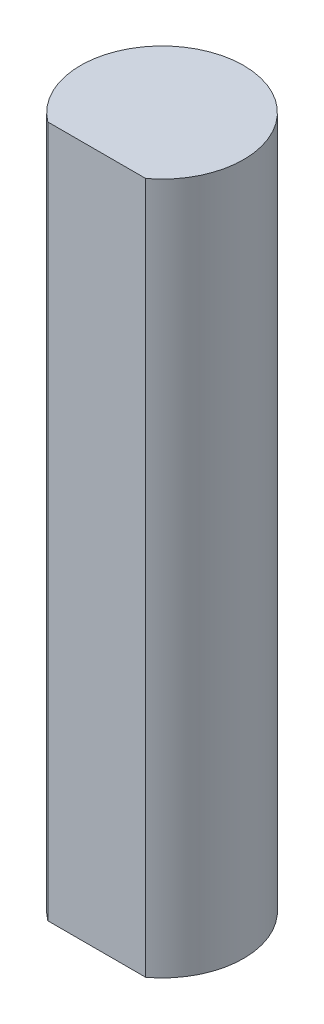
ISO-10303-21;
HEADER;
FILE_DESCRIPTION(('STEP AP214'),'2;1');
FILE_NAME('part.step','',(''),(''),'','','');
FILE_SCHEMA(('AUTOMOTIVE_DESIGN { 1 0 10303 214 1 1 1 1 }'));
ENDSEC;
DATA;
#1=APPLICATION_CONTEXT('core data for automotive mechanical design processes');
#2=APPLICATION_PROTOCOL_DEFINITION('international standard','automotive_design',2000,#1);
#3=PRODUCT_CONTEXT('',#1,'mechanical');
#4=PRODUCT('Part','Part','',(#3));
#5=PRODUCT_RELATED_PRODUCT_CATEGORY('part','',(#4));
#6=PRODUCT_DEFINITION_FORMATION('','',#4);
#7=PRODUCT_DEFINITION_CONTEXT('part definition',#1,'design');
#8=PRODUCT_DEFINITION('design','',#6,#7);
#9=PRODUCT_DEFINITION_SHAPE('','',#8);
#10=(LENGTH_UNIT() NAMED_UNIT(*) SI_UNIT(.MILLI.,.METRE.));
#11=(NAMED_UNIT(*) PLANE_ANGLE_UNIT() SI_UNIT($,.RADIAN.));
#12=(NAMED_UNIT(*) SI_UNIT($,.STERADIAN.) SOLID_ANGLE_UNIT());
#13=UNCERTAINTY_MEASURE_WITH_UNIT(LENGTH_MEASURE(1.E-05),#10,'distance_accuracy_value','');
#14=(GEOMETRIC_REPRESENTATION_CONTEXT(3) GLOBAL_UNCERTAINTY_ASSIGNED_CONTEXT((#13)) GLOBAL_UNIT_ASSIGNED_CONTEXT((#10,
#11,#12)) REPRESENTATION_CONTEXT('',''));
#15=CARTESIAN_POINT('',(0.,0.,0.));
#16=DIRECTION('',(0.,0.,1.));
#17=DIRECTION('',(1.,0.,0.));
#18=AXIS2_PLACEMENT_3D('',#15,#16,#17);
#19=CARTESIAN_POINT('',(0.,63.09,0.));
#20=DIRECTION('',(0.,-1.,0.));
#21=DIRECTION('',(0.,0.,-1.));
#22=AXIS2_PLACEMENT_3D('',#19,#20,#21);
#23=CYLINDRICAL_SURFACE('',#22,2.5);
#24=CARTESIAN_POINT('',(0.,41.89,0.));
#25=DIRECTION('',(0.,1.,0.));
#26=DIRECTION('',(0.,0.,1.));
#27=AXIS2_PLACEMENT_3D('',#24,#25,#26);
#28=CIRCLE('',#27,2.5);
#29=CARTESIAN_POINT('',(1.5,41.89,2.));
#30=VERTEX_POINT('',#29);
#31=CARTESIAN_POINT('',(-1.5,41.89,2.));
#32=VERTEX_POINT('',#31);
#33=EDGE_CURVE('E82',#30,#32,#28,.T.);
#34=ORIENTED_EDGE('',*,*,#33,.T.);
#35=DIRECTION('',(0.,-1.,0.));
#36=VECTOR('',#35,1.);
#37=CARTESIAN_POINT('',(-1.5,63.09,2.));
#38=LINE('',#37,#36);
#39=CARTESIAN_POINT('',(-1.5,63.09,2.));
#40=VERTEX_POINT('',#39);
#41=EDGE_CURVE('E11',#40,#32,#38,.T.);
#42=ORIENTED_EDGE('',*,*,#41,.F.);
#43=CARTESIAN_POINT('',(0.,63.09,0.));
#44=DIRECTION('',(0.,1.,0.));
#45=DIRECTION('',(0.,0.,1.));
#46=AXIS2_PLACEMENT_3D('',#43,#44,#45);
#47=CIRCLE('',#46,2.5);
#48=CARTESIAN_POINT('',(1.5,63.09,2.));
#49=VERTEX_POINT('',#48);
#50=EDGE_CURVE('E81',#49,#40,#47,.T.);
#51=ORIENTED_EDGE('',*,*,#50,.F.);
#52=DIRECTION('',(0.,-1.,0.));
#53=VECTOR('',#52,1.);
#54=CARTESIAN_POINT('',(1.5,63.09,2.));
#55=LINE('',#54,#53);
#56=EDGE_CURVE('E54',#49,#30,#55,.T.);
#57=ORIENTED_EDGE('',*,*,#56,.T.);
#58=EDGE_LOOP('',(#34,#42,#51,#57));
#59=FACE_BOUND('',#58,.T.);
#60=ADVANCED_FACE('F45',(#59),#23,.T.);
#61=CARTESIAN_POINT('',(-1.5,63.09,2.));
#62=DIRECTION('',(0.,0.,-1.));
#63=DIRECTION('',(-1.,0.,0.));
#64=AXIS2_PLACEMENT_3D('',#61,#62,#63);
#65=PLANE('',#64);
#66=DIRECTION('',(1.,0.,0.));
#67=VECTOR('',#66,1.);
#68=CARTESIAN_POINT('',(-1.5,41.89,2.));
#69=LINE('',#68,#67);
#70=EDGE_CURVE('E73',#32,#30,#69,.T.);
#71=ORIENTED_EDGE('',*,*,#70,.T.);
#72=ORIENTED_EDGE('',*,*,#56,.F.);
#73=DIRECTION('',(1.,0.,0.));
#74=VECTOR('',#73,1.);
#75=CARTESIAN_POINT('',(-1.5,63.09,2.));
#76=LINE('',#75,#74);
#77=EDGE_CURVE('E64',#40,#49,#76,.T.);
#78=ORIENTED_EDGE('',*,*,#77,.F.);
#79=ORIENTED_EDGE('',*,*,#41,.T.);
#80=EDGE_LOOP('',(#71,#72,#78,#79));
#81=FACE_BOUND('',#80,.T.);
#82=ADVANCED_FACE('F76',(#81),#65,.F.);
#83=CARTESIAN_POINT('',(0.,63.09,0.));
#84=DIRECTION('',(0.,1.,0.));
#85=DIRECTION('',(0.,0.,1.));
#86=AXIS2_PLACEMENT_3D('',#83,#84,#85);
#87=PLANE('',#86);
#88=ORIENTED_EDGE('',*,*,#50,.T.);
#89=ORIENTED_EDGE('',*,*,#77,.T.);
#90=EDGE_LOOP('',(#88,#89));
#91=FACE_BOUND('',#90,.T.);
#92=ADVANCED_FACE('F93',(#91),#87,.T.);
#93=CARTESIAN_POINT('',(0.,41.89,0.));
#94=DIRECTION('',(0.,1.,0.));
#95=DIRECTION('',(0.,0.,1.));
#96=AXIS2_PLACEMENT_3D('',#93,#94,#95);
#97=PLANE('',#96);
#98=ORIENTED_EDGE('',*,*,#33,.F.);
#99=ORIENTED_EDGE('',*,*,#70,.F.);
#100=EDGE_LOOP('',(#98,#99));
#101=FACE_BOUND('',#100,.T.);
#102=ADVANCED_FACE('F86',(#101),#97,.F.);
#103=CLOSED_SHELL('',(#60,#82,#92,#102));
#104=MANIFOLD_SOLID_BREP('B2',#103);
#105=ADVANCED_BREP_SHAPE_REPRESENTATION('',(#18,#104),#14);
#106=SHAPE_DEFINITION_REPRESENTATION(#9,#105);
ENDSEC;
END-ISO-10303-21;
